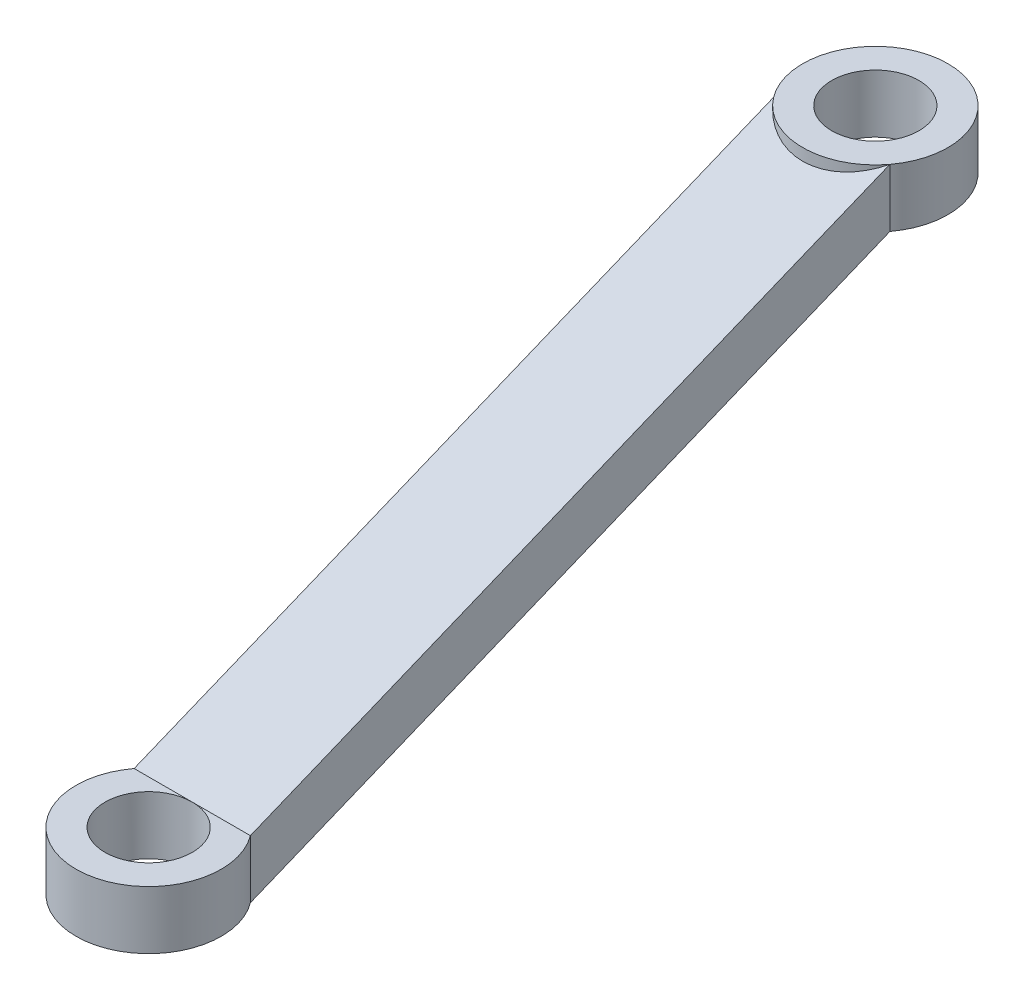
ISO-10303-21;
HEADER;
FILE_DESCRIPTION(('STEP AP214'),'2;1');
FILE_NAME('part.step','',(''),(''),'','','');
FILE_SCHEMA(('AUTOMOTIVE_DESIGN { 1 0 10303 214 1 1 1 1 }'));
ENDSEC;
DATA;
#1=APPLICATION_CONTEXT('core data for automotive mechanical design processes');
#2=APPLICATION_PROTOCOL_DEFINITION('international standard','automotive_design',2000,#1);
#3=PRODUCT_CONTEXT('',#1,'mechanical');
#4=PRODUCT('Part','Part','',(#3));
#5=PRODUCT_RELATED_PRODUCT_CATEGORY('part','',(#4));
#6=PRODUCT_DEFINITION_FORMATION('','',#4);
#7=PRODUCT_DEFINITION_CONTEXT('part definition',#1,'design');
#8=PRODUCT_DEFINITION('design','',#6,#7);
#9=PRODUCT_DEFINITION_SHAPE('','',#8);
#10=(LENGTH_UNIT() NAMED_UNIT(*) SI_UNIT(.MILLI.,.METRE.));
#11=(NAMED_UNIT(*) PLANE_ANGLE_UNIT() SI_UNIT($,.RADIAN.));
#12=(NAMED_UNIT(*) SI_UNIT($,.STERADIAN.) SOLID_ANGLE_UNIT());
#13=UNCERTAINTY_MEASURE_WITH_UNIT(LENGTH_MEASURE(1.E-05),#10,'distance_accuracy_value','');
#14=(GEOMETRIC_REPRESENTATION_CONTEXT(3) GLOBAL_UNCERTAINTY_ASSIGNED_CONTEXT((#13)) GLOBAL_UNIT_ASSIGNED_CONTEXT((#10,
#11,#12)) REPRESENTATION_CONTEXT('',''));
#15=CARTESIAN_POINT('',(0.,0.,0.));
#16=DIRECTION('',(0.,0.,1.));
#17=DIRECTION('',(1.,0.,0.));
#18=AXIS2_PLACEMENT_3D('',#15,#16,#17);
#19=CARTESIAN_POINT('',(4.,8.99999999999999,-22.));
#20=DIRECTION('',(0.,0.925546956205677,0.378632845720504));
#21=DIRECTION('',(0.,-0.378632845720504,0.925546956205677));
#22=AXIS2_PLACEMENT_3D('',#19,#20,#21);
#23=PLANE('',#22);
#24=CARTESIAN_POINT('',(2.,-0.613636363636364,1.5));
#25=DIRECTION('',(0.,0.925546956205677,0.378632845720504));
#26=DIRECTION('',(0.,-0.378632845720504,0.925546956205677));
#27=AXIS2_PLACEMENT_3D('',#24,#25,#26);
#28=ELLIPSE('',#27,2.70110552818289,2.5);
#29=CARTESIAN_POINT('',(0.,0.,0.));
#30=VERTEX_POINT('',#29);
#31=CARTESIAN_POINT('',(4.,0.,0.));
#32=VERTEX_POINT('',#31);
#33=EDGE_CURVE('E124',#30,#32,#28,.F.);
#34=ORIENTED_EDGE('',*,*,#33,.F.);
#35=DIRECTION('',(0.,0.378632845720504,-0.925546956205677));
#36=VECTOR('',#35,1.);
#37=CARTESIAN_POINT('',(0.,8.99999999999999,-22.));
#38=LINE('',#37,#36);
#39=CARTESIAN_POINT('',(0.,8.99999999999999,-22.));
#40=VERTEX_POINT('',#39);
#41=EDGE_CURVE('E110',#30,#40,#38,.T.);
#42=ORIENTED_EDGE('',*,*,#41,.T.);
#43=DIRECTION('',(-1.,0.,0.));
#44=VECTOR('',#43,1.);
#45=CARTESIAN_POINT('',(4.,8.99999999999999,-22.));
#46=LINE('',#45,#44);
#47=CARTESIAN_POINT('',(1.99999999999998,8.99999999999999,-22.));
#48=VERTEX_POINT('',#47);
#49=EDGE_CURVE('E40',#48,#40,#46,.T.);
#50=ORIENTED_EDGE('',*,*,#49,.F.);
#51=CARTESIAN_POINT('',(4.,8.99999999999999,-22.));
#52=VERTEX_POINT('',#51);
#53=EDGE_CURVE('E11',#52,#48,#46,.T.);
#54=ORIENTED_EDGE('',*,*,#53,.F.);
#55=DIRECTION('',(0.,0.378632845720504,-0.925546956205677));
#56=VECTOR('',#55,1.);
#57=CARTESIAN_POINT('',(4.,8.99999999999999,-22.));
#58=LINE('',#57,#56);
#59=EDGE_CURVE('E130',#32,#52,#58,.T.);
#60=ORIENTED_EDGE('',*,*,#59,.F.);
#61=EDGE_LOOP('',(#34,#42,#50,#54,#60));
#62=FACE_BOUND('',#61,.T.);
#63=ADVANCED_FACE('F32',(#62),#23,.F.);
#64=CARTESIAN_POINT('',(4.,2.,0.));
#65=DIRECTION('',(0.,-0.925546956205677,-0.378632845720504));
#66=DIRECTION('',(0.,0.378632845720504,-0.925546956205677));
#67=AXIS2_PLACEMENT_3D('',#64,#65,#66);
#68=PLANE('',#67);
#69=DIRECTION('',(0.,-0.378632845720504,0.925546956205677));
#70=VECTOR('',#69,1.);
#71=CARTESIAN_POINT('',(4.,2.,0.));
#72=LINE('',#71,#70);
#73=CARTESIAN_POINT('',(4.,11.,-22.));
#74=VERTEX_POINT('',#73);
#75=CARTESIAN_POINT('',(4.,2.,0.));
#76=VERTEX_POINT('',#75);
#77=EDGE_CURVE('E94',#74,#76,#72,.T.);
#78=ORIENTED_EDGE('',*,*,#77,.F.);
#79=CARTESIAN_POINT('',(2.,11.6136363636364,-23.5));
#80=DIRECTION('',(0.,-0.925546956205677,-0.378632845720504));
#81=DIRECTION('',(0.,-0.378632845720504,0.925546956205677));
#82=AXIS2_PLACEMENT_3D('',#79,#80,#81);
#83=ELLIPSE('',#82,2.70110552818289,2.5);
#84=CARTESIAN_POINT('',(0.,11.,-22.));
#85=VERTEX_POINT('',#84);
#86=EDGE_CURVE('E91',#74,#85,#83,.T.);
#87=ORIENTED_EDGE('',*,*,#86,.T.);
#88=DIRECTION('',(0.,-0.378632845720504,0.925546956205677));
#89=VECTOR('',#88,1.);
#90=CARTESIAN_POINT('',(0.,2.,0.));
#91=LINE('',#90,#89);
#92=CARTESIAN_POINT('',(0.,2.,0.));
#93=VERTEX_POINT('',#92);
#94=EDGE_CURVE('E77',#85,#93,#91,.T.);
#95=ORIENTED_EDGE('',*,*,#94,.T.);
#96=DIRECTION('',(-1.,0.,0.));
#97=VECTOR('',#96,1.);
#98=CARTESIAN_POINT('',(4.,2.,0.));
#99=LINE('',#98,#97);
#100=CARTESIAN_POINT('',(2.,2.,0.));
#101=VERTEX_POINT('',#100);
#102=EDGE_CURVE('E137',#101,#93,#99,.T.);
#103=ORIENTED_EDGE('',*,*,#102,.F.);
#104=EDGE_CURVE('E140',#76,#101,#99,.T.);
#105=ORIENTED_EDGE('',*,*,#104,.F.);
#106=EDGE_LOOP('',(#78,#87,#95,#103,#105));
#107=FACE_BOUND('',#106,.T.);
#108=ADVANCED_FACE('F92',(#107),#68,.F.);
#109=CARTESIAN_POINT('',(4.,0.,0.));
#110=DIRECTION('',(-1.,0.,0.));
#111=DIRECTION('',(0.,0.,1.));
#112=AXIS2_PLACEMENT_3D('',#109,#110,#111);
#113=PLANE('',#112);
#114=ORIENTED_EDGE('',*,*,#59,.T.);
#115=DIRECTION('',(0.,1.,0.));
#116=VECTOR('',#115,1.);
#117=CARTESIAN_POINT('',(4.,11.,-22.));
#118=LINE('',#117,#116);
#119=EDGE_CURVE('E132',#52,#74,#118,.T.);
#120=ORIENTED_EDGE('',*,*,#119,.T.);
#121=ORIENTED_EDGE('',*,*,#77,.T.);
#122=DIRECTION('',(0.,-1.,0.));
#123=VECTOR('',#122,1.);
#124=CARTESIAN_POINT('',(4.,0.,0.));
#125=LINE('',#124,#123);
#126=EDGE_CURVE('E135',#76,#32,#125,.T.);
#127=ORIENTED_EDGE('',*,*,#126,.T.);
#128=EDGE_LOOP('',(#114,#120,#121,#127));
#129=FACE_BOUND('',#128,.T.);
#130=ADVANCED_FACE('F152',(#129),#113,.F.);
#131=CARTESIAN_POINT('',(0.,0.,0.));
#132=DIRECTION('',(-1.,0.,0.));
#133=DIRECTION('',(0.,0.,1.));
#134=AXIS2_PLACEMENT_3D('',#131,#132,#133);
#135=PLANE('',#134);
#136=ORIENTED_EDGE('',*,*,#41,.F.);
#137=DIRECTION('',(0.,-1.,0.));
#138=VECTOR('',#137,1.);
#139=CARTESIAN_POINT('',(0.,0.,0.));
#140=LINE('',#139,#138);
#141=EDGE_CURVE('E84',#93,#30,#140,.T.);
#142=ORIENTED_EDGE('',*,*,#141,.F.);
#143=ORIENTED_EDGE('',*,*,#94,.F.);
#144=DIRECTION('',(0.,1.,0.));
#145=VECTOR('',#144,1.);
#146=CARTESIAN_POINT('',(0.,11.,-22.));
#147=LINE('',#146,#145);
#148=EDGE_CURVE('E81',#40,#85,#147,.T.);
#149=ORIENTED_EDGE('',*,*,#148,.F.);
#150=EDGE_LOOP('',(#136,#142,#143,#149));
#151=FACE_BOUND('',#150,.T.);
#152=ADVANCED_FACE('F79',(#151),#135,.T.);
#153=CARTESIAN_POINT('',(2.,2.,1.5));
#154=DIRECTION('',(0.,-1.,0.));
#155=DIRECTION('',(0.,0.,-1.));
#156=AXIS2_PLACEMENT_3D('',#153,#154,#155);
#157=CYLINDRICAL_SURFACE('',#156,2.5);
#158=CARTESIAN_POINT('',(2.,0.,1.5));
#159=DIRECTION('',(0.,1.,0.));
#160=DIRECTION('',(0.,0.,1.));
#161=AXIS2_PLACEMENT_3D('',#158,#159,#160);
#162=CIRCLE('',#161,2.5);
#163=EDGE_CURVE('E98',#30,#32,#162,.T.);
#164=ORIENTED_EDGE('',*,*,#163,.T.);
#165=ORIENTED_EDGE('',*,*,#126,.F.);
#166=CARTESIAN_POINT('',(2.,2.,1.5));
#167=DIRECTION('',(0.,1.,0.));
#168=DIRECTION('',(0.,0.,1.));
#169=AXIS2_PLACEMENT_3D('',#166,#167,#168);
#170=CIRCLE('',#169,2.5);
#171=EDGE_CURVE('E121',#93,#76,#170,.T.);
#172=ORIENTED_EDGE('',*,*,#171,.F.);
#173=ORIENTED_EDGE('',*,*,#141,.T.);
#174=EDGE_LOOP('',(#164,#165,#172,#173));
#175=FACE_BOUND('',#174,.T.);
#176=ADVANCED_FACE('F147',(#175),#157,.T.);
#177=EDGE_CURVE('E125',#32,#30,#162,.T.);
#178=ORIENTED_EDGE('',*,*,#177,.T.);
#179=ORIENTED_EDGE('',*,*,#33,.T.);
#180=EDGE_LOOP('',(#178,#179));
#181=FACE_BOUND('',#180,.T.);
#182=ADVANCED_FACE('F158',(#181),#157,.T.);
#183=CARTESIAN_POINT('',(2.,2.,1.5));
#184=DIRECTION('',(0.,1.,0.));
#185=DIRECTION('',(0.,0.,1.));
#186=AXIS2_PLACEMENT_3D('',#183,#184,#185);
#187=PLANE('',#186);
#188=ORIENTED_EDGE('',*,*,#104,.T.);
#189=CARTESIAN_POINT('',(2.,2.,1.5));
#190=DIRECTION('',(0.,1.,0.));
#191=DIRECTION('',(0.,0.,1.));
#192=AXIS2_PLACEMENT_3D('',#189,#190,#191);
#193=CIRCLE('',#192,1.5);
#194=EDGE_CURVE('E49',#101,#101,#193,.T.);
#195=ORIENTED_EDGE('',*,*,#194,.F.);
#196=ORIENTED_EDGE('',*,*,#102,.T.);
#197=ORIENTED_EDGE('',*,*,#171,.T.);
#198=EDGE_LOOP('',(#188,#195,#196,#197));
#199=FACE_BOUND('',#198,.T.);
#200=ADVANCED_FACE('F143',(#199),#187,.T.);
#201=CARTESIAN_POINT('',(2.,0.,1.5));
#202=DIRECTION('',(0.,1.,0.));
#203=DIRECTION('',(0.,0.,1.));
#204=AXIS2_PLACEMENT_3D('',#201,#202,#203);
#205=PLANE('',#204);
#206=CARTESIAN_POINT('',(2.,0.,1.5));
#207=DIRECTION('',(0.,1.,0.));
#208=DIRECTION('',(0.,0.,1.));
#209=AXIS2_PLACEMENT_3D('',#206,#207,#208);
#210=CIRCLE('',#209,1.5);
#211=CARTESIAN_POINT('',(2.,0.,3.));
#212=VERTEX_POINT('',#211);
#213=EDGE_CURVE('E119',#212,#212,#210,.T.);
#214=ORIENTED_EDGE('',*,*,#213,.T.);
#215=EDGE_LOOP('',(#214));
#216=FACE_BOUND('',#215,.T.);
#217=ORIENTED_EDGE('',*,*,#163,.F.);
#218=ORIENTED_EDGE('',*,*,#177,.F.);
#219=EDGE_LOOP('',(#217,#218));
#220=FACE_BOUND('',#219,.T.);
#221=ADVANCED_FACE('F160',(#216,#220),#205,.F.);
#222=CARTESIAN_POINT('',(2.,11.,-23.5));
#223=DIRECTION('',(0.,-1.,0.));
#224=DIRECTION('',(0.,0.,-1.));
#225=AXIS2_PLACEMENT_3D('',#222,#223,#224);
#226=CYLINDRICAL_SURFACE('',#225,2.5);
#227=ORIENTED_EDGE('',*,*,#119,.F.);
#228=CARTESIAN_POINT('',(2.,9.,-23.5));
#229=DIRECTION('',(0.,-1.,0.));
#230=DIRECTION('',(0.,0.,-1.));
#231=AXIS2_PLACEMENT_3D('',#228,#229,#230);
#232=CIRCLE('',#231,2.5);
#233=EDGE_CURVE('E109',#40,#52,#232,.T.);
#234=ORIENTED_EDGE('',*,*,#233,.F.);
#235=ORIENTED_EDGE('',*,*,#148,.T.);
#236=CARTESIAN_POINT('',(2.,11.,-23.5));
#237=DIRECTION('',(0.,-1.,0.));
#238=DIRECTION('',(0.,0.,-1.));
#239=AXIS2_PLACEMENT_3D('',#236,#237,#238);
#240=CIRCLE('',#239,2.5);
#241=EDGE_CURVE('E106',#85,#74,#240,.T.);
#242=ORIENTED_EDGE('',*,*,#241,.T.);
#243=EDGE_LOOP('',(#227,#234,#235,#242));
#244=FACE_BOUND('',#243,.T.);
#245=ADVANCED_FACE('F105',(#244),#226,.T.);
#246=ORIENTED_EDGE('',*,*,#86,.F.);
#247=EDGE_CURVE('E99',#74,#85,#240,.T.);
#248=ORIENTED_EDGE('',*,*,#247,.T.);
#249=EDGE_LOOP('',(#246,#248));
#250=FACE_BOUND('',#249,.T.);
#251=ADVANCED_FACE('F115',(#250),#226,.T.);
#252=CARTESIAN_POINT('',(2.,11.,-23.5));
#253=DIRECTION('',(0.,-1.,0.));
#254=DIRECTION('',(0.,0.,-1.));
#255=AXIS2_PLACEMENT_3D('',#252,#253,#254);
#256=PLANE('',#255);
#257=CARTESIAN_POINT('',(1.99999999999998,11.,-23.5));
#258=DIRECTION('',(0.,1.,0.));
#259=DIRECTION('',(0.,0.,1.));
#260=AXIS2_PLACEMENT_3D('',#257,#258,#259);
#261=CIRCLE('',#260,1.5);
#262=CARTESIAN_POINT('',(1.99999999999998,11.,-22.));
#263=VERTEX_POINT('',#262);
#264=EDGE_CURVE('E254',#263,#263,#261,.T.);
#265=ORIENTED_EDGE('',*,*,#264,.F.);
#266=EDGE_LOOP('',(#265));
#267=FACE_BOUND('',#266,.T.);
#268=ORIENTED_EDGE('',*,*,#247,.F.);
#269=ORIENTED_EDGE('',*,*,#241,.F.);
#270=EDGE_LOOP('',(#268,#269));
#271=FACE_BOUND('',#270,.T.);
#272=ADVANCED_FACE('F113',(#267,#271),#256,.F.);
#273=CARTESIAN_POINT('',(2.,9.,-23.5));
#274=DIRECTION('',(0.,-1.,0.));
#275=DIRECTION('',(0.,0.,-1.));
#276=AXIS2_PLACEMENT_3D('',#273,#274,#275);
#277=PLANE('',#276);
#278=ORIENTED_EDGE('',*,*,#53,.T.);
#279=CARTESIAN_POINT('',(1.99999999999998,9.,-23.5));
#280=DIRECTION('',(0.,-1.,0.));
#281=DIRECTION('',(0.,0.,-1.));
#282=AXIS2_PLACEMENT_3D('',#279,#280,#281);
#283=CIRCLE('',#282,1.5);
#284=EDGE_CURVE('E35',#48,#48,#283,.T.);
#285=ORIENTED_EDGE('',*,*,#284,.F.);
#286=ORIENTED_EDGE('',*,*,#49,.T.);
#287=ORIENTED_EDGE('',*,*,#233,.T.);
#288=EDGE_LOOP('',(#278,#285,#286,#287));
#289=FACE_BOUND('',#288,.T.);
#290=ADVANCED_FACE('F211',(#289),#277,.T.);
#291=CARTESIAN_POINT('',(2.,0.,1.5));
#292=DIRECTION('',(0.,1.,0.));
#293=DIRECTION('',(0.,0.,1.));
#294=AXIS2_PLACEMENT_3D('',#291,#292,#293);
#295=CYLINDRICAL_SURFACE('',#294,1.5);
#296=ORIENTED_EDGE('',*,*,#213,.F.);
#297=EDGE_LOOP('',(#296));
#298=FACE_BOUND('',#297,.T.);
#299=ORIENTED_EDGE('',*,*,#194,.T.);
#300=EDGE_LOOP('',(#299));
#301=FACE_BOUND('',#300,.T.);
#302=ADVANCED_FACE('F206',(#298,#301),#295,.F.);
#303=CARTESIAN_POINT('',(1.99999999999998,0.,-23.5));
#304=DIRECTION('',(0.,1.,0.));
#305=DIRECTION('',(0.,0.,1.));
#306=AXIS2_PLACEMENT_3D('',#303,#304,#305);
#307=CYLINDRICAL_SURFACE('',#306,1.5);
#308=ORIENTED_EDGE('',*,*,#284,.T.);
#309=EDGE_LOOP('',(#308));
#310=FACE_BOUND('',#309,.T.);
#311=ORIENTED_EDGE('',*,*,#264,.T.);
#312=EDGE_LOOP('',(#311));
#313=FACE_BOUND('',#312,.T.);
#314=ADVANCED_FACE('F210',(#310,#313),#307,.F.);
#315=CLOSED_SHELL('',(#63,#108,#130,#152,#176,#182,#200,#221,#245,#251,#272,#290,#302,#314));
#316=MANIFOLD_SOLID_BREP('B2',#315);
#317=ADVANCED_BREP_SHAPE_REPRESENTATION('',(#18,#316),#14);
#318=SHAPE_DEFINITION_REPRESENTATION(#9,#317);
ENDSEC;
END-ISO-10303-21;
